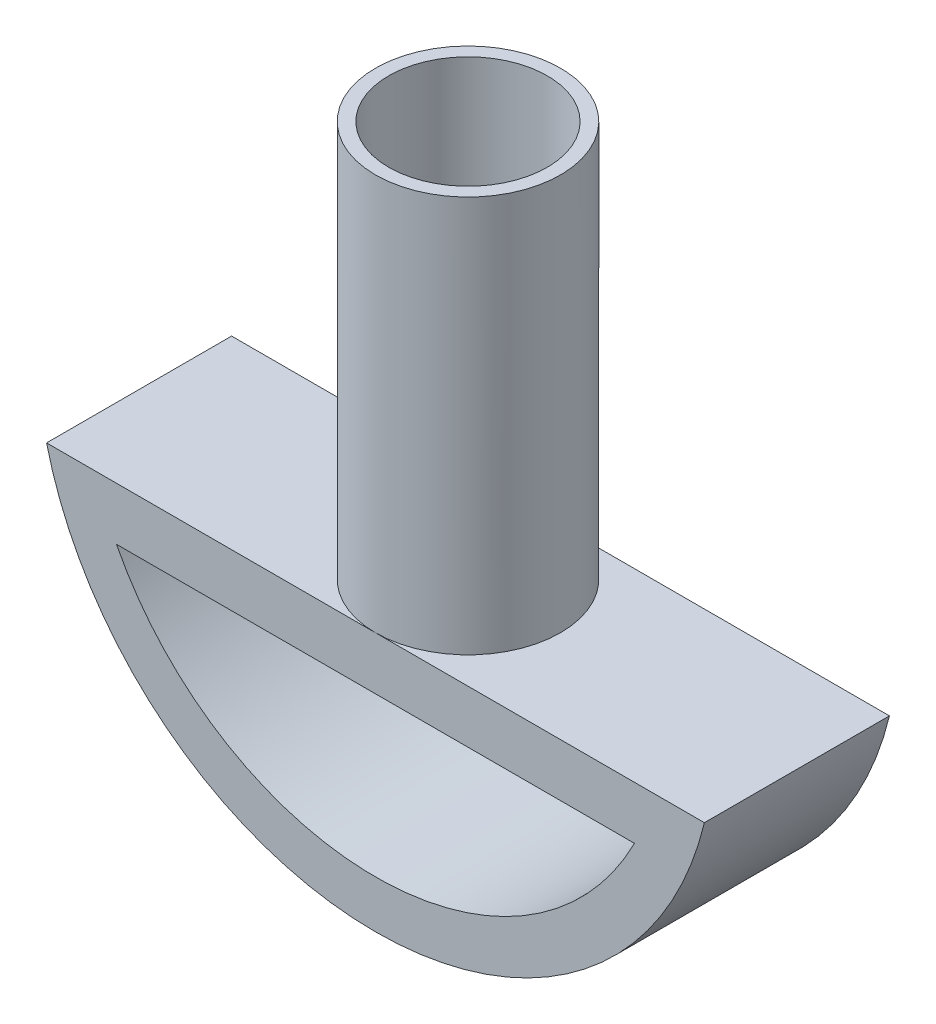
ISO-10303-21;
HEADER;
FILE_DESCRIPTION(('STEP AP214'),'2;1');
FILE_NAME('part.step','',(''),(''),'','','');
FILE_SCHEMA(('AUTOMOTIVE_DESIGN { 1 0 10303 214 1 1 1 1 }'));
ENDSEC;
DATA;
#1=APPLICATION_CONTEXT('core data for automotive mechanical design processes');
#2=APPLICATION_PROTOCOL_DEFINITION('international standard','automotive_design',2000,#1);
#3=PRODUCT_CONTEXT('',#1,'mechanical');
#4=PRODUCT('Part','Part','',(#3));
#5=PRODUCT_RELATED_PRODUCT_CATEGORY('part','',(#4));
#6=PRODUCT_DEFINITION_FORMATION('','',#4);
#7=PRODUCT_DEFINITION_CONTEXT('part definition',#1,'design');
#8=PRODUCT_DEFINITION('design','',#6,#7);
#9=PRODUCT_DEFINITION_SHAPE('','',#8);
#10=(LENGTH_UNIT() NAMED_UNIT(*) SI_UNIT(.MILLI.,.METRE.));
#11=(NAMED_UNIT(*) PLANE_ANGLE_UNIT() SI_UNIT($,.RADIAN.));
#12=(NAMED_UNIT(*) SI_UNIT($,.STERADIAN.) SOLID_ANGLE_UNIT());
#13=UNCERTAINTY_MEASURE_WITH_UNIT(LENGTH_MEASURE(1.E-05),#10,'distance_accuracy_value','');
#14=(GEOMETRIC_REPRESENTATION_CONTEXT(3) GLOBAL_UNCERTAINTY_ASSIGNED_CONTEXT((#13)) GLOBAL_UNIT_ASSIGNED_CONTEXT((#10,
#11,#12)) REPRESENTATION_CONTEXT('',''));
#15=CARTESIAN_POINT('',(0.,0.,0.));
#16=DIRECTION('',(0.,0.,1.));
#17=DIRECTION('',(1.,0.,0.));
#18=AXIS2_PLACEMENT_3D('',#15,#16,#17);
#19=CARTESIAN_POINT('',(-62.2173609212091,-15.,35.));
#20=DIRECTION('',(0.,-1.,0.));
#21=DIRECTION('',(0.,0.,-1.));
#22=AXIS2_PLACEMENT_3D('',#19,#20,#21);
#23=PLANE('',#22);
#24=CARTESIAN_POINT('',(0.,-15.,17.5));
#25=DIRECTION('',(0.,1.,0.));
#26=DIRECTION('',(0.,0.,1.));
#27=AXIS2_PLACEMENT_3D('',#24,#25,#26);
#28=CIRCLE('',#27,17.5);
#29=CARTESIAN_POINT('',(0.,-15.,0.));
#30=VERTEX_POINT('',#29);
#31=CARTESIAN_POINT('',(0.,-15.,35.));
#32=VERTEX_POINT('',#31);
#33=EDGE_CURVE('E95',#30,#32,#28,.T.);
#34=ORIENTED_EDGE('',*,*,#33,.F.);
#35=DIRECTION('',(-1.,0.,0.));
#36=VECTOR('',#35,1.);
#37=CARTESIAN_POINT('',(-62.2173609212091,-15.,0.));
#38=LINE('',#37,#36);
#39=CARTESIAN_POINT('',(-62.2173609212091,-15.,0.));
#40=VERTEX_POINT('',#39);
#41=EDGE_CURVE('E86',#30,#40,#38,.T.);
#42=ORIENTED_EDGE('',*,*,#41,.T.);
#43=DIRECTION('',(0.,0.,-1.));
#44=VECTOR('',#43,1.);
#45=CARTESIAN_POINT('',(-62.2173609212091,-15.,35.));
#46=LINE('',#45,#44);
#47=CARTESIAN_POINT('',(-62.2173609212091,-15.,35.));
#48=VERTEX_POINT('',#47);
#49=EDGE_CURVE('E42',#48,#40,#46,.T.);
#50=ORIENTED_EDGE('',*,*,#49,.F.);
#51=DIRECTION('',(-1.,0.,0.));
#52=VECTOR('',#51,1.);
#53=CARTESIAN_POINT('',(-62.2173609212091,-15.,35.));
#54=LINE('',#53,#52);
#55=EDGE_CURVE('E96',#32,#48,#54,.T.);
#56=ORIENTED_EDGE('',*,*,#55,.F.);
#57=EDGE_LOOP('',(#34,#42,#50,#56));
#58=FACE_BOUND('',#57,.T.);
#59=ADVANCED_FACE('F33',(#58),#23,.F.);
#60=CARTESIAN_POINT('',(0.,0.,35.));
#61=DIRECTION('',(0.,0.,-1.));
#62=DIRECTION('',(-1.,0.,0.));
#63=AXIS2_PLACEMENT_3D('',#60,#61,#62);
#64=CYLINDRICAL_SURFACE('',#63,64.);
#65=CARTESIAN_POINT('',(0.,0.,0.));
#66=DIRECTION('',(0.,0.,1.));
#67=DIRECTION('',(1.,0.,0.));
#68=AXIS2_PLACEMENT_3D('',#65,#66,#67);
#69=CIRCLE('',#68,64.);
#70=CARTESIAN_POINT('',(62.2173609212091,-15.,0.));
#71=VERTEX_POINT('',#70);
#72=EDGE_CURVE('E90',#40,#71,#69,.T.);
#73=ORIENTED_EDGE('',*,*,#72,.T.);
#74=DIRECTION('',(0.,0.,-1.));
#75=VECTOR('',#74,1.);
#76=CARTESIAN_POINT('',(62.2173609212091,-15.,35.));
#77=LINE('',#76,#75);
#78=CARTESIAN_POINT('',(62.2173609212091,-15.,35.));
#79=VERTEX_POINT('',#78);
#80=EDGE_CURVE('E11',#79,#71,#77,.T.);
#81=ORIENTED_EDGE('',*,*,#80,.F.);
#82=CARTESIAN_POINT('',(0.,0.,35.));
#83=DIRECTION('',(0.,0.,1.));
#84=DIRECTION('',(1.,0.,0.));
#85=AXIS2_PLACEMENT_3D('',#82,#83,#84);
#86=CIRCLE('',#85,64.);
#87=EDGE_CURVE('E85',#48,#79,#86,.T.);
#88=ORIENTED_EDGE('',*,*,#87,.F.);
#89=ORIENTED_EDGE('',*,*,#49,.T.);
#90=EDGE_LOOP('',(#73,#81,#88,#89));
#91=FACE_BOUND('',#90,.T.);
#92=ADVANCED_FACE('F35',(#91),#64,.T.);
#93=EDGE_CURVE('E49',#32,#30,#28,.T.);
#94=ORIENTED_EDGE('',*,*,#93,.F.);
#95=EDGE_CURVE('E123',#79,#32,#54,.T.);
#96=ORIENTED_EDGE('',*,*,#95,.F.);
#97=ORIENTED_EDGE('',*,*,#80,.T.);
#98=EDGE_CURVE('E78',#71,#30,#38,.T.);
#99=ORIENTED_EDGE('',*,*,#98,.T.);
#100=EDGE_LOOP('',(#94,#96,#97,#99));
#101=FACE_BOUND('',#100,.T.);
#102=ADVANCED_FACE('F80',(#101),#23,.F.);
#103=CARTESIAN_POINT('',(0.,0.,35.));
#104=DIRECTION('',(0.,0.,1.));
#105=DIRECTION('',(1.,0.,0.));
#106=AXIS2_PLACEMENT_3D('',#103,#104,#105);
#107=PLANE('',#106);
#108=CARTESIAN_POINT('',(0.,0.,35.));
#109=DIRECTION('',(0.,0.,1.));
#110=DIRECTION('',(1.,0.,0.));
#111=AXIS2_PLACEMENT_3D('',#108,#109,#110);
#112=CIRCLE('',#111,55.);
#113=CARTESIAN_POINT('',(-48.9897948556636,-25.,35.));
#114=VERTEX_POINT('',#113);
#115=CARTESIAN_POINT('',(48.9897948556636,-25.,35.));
#116=VERTEX_POINT('',#115);
#117=EDGE_CURVE('E57',#114,#116,#112,.T.);
#118=ORIENTED_EDGE('',*,*,#117,.F.);
#119=DIRECTION('',(-1.,0.,0.));
#120=VECTOR('',#119,1.);
#121=CARTESIAN_POINT('',(-48.9897948556636,-25.,35.));
#122=LINE('',#121,#120);
#123=EDGE_CURVE('E111',#116,#114,#122,.T.);
#124=ORIENTED_EDGE('',*,*,#123,.F.);
#125=EDGE_LOOP('',(#118,#124));
#126=FACE_BOUND('',#125,.T.);
#127=ORIENTED_EDGE('',*,*,#87,.T.);
#128=ORIENTED_EDGE('',*,*,#95,.T.);
#129=ORIENTED_EDGE('',*,*,#55,.T.);
#130=EDGE_LOOP('',(#127,#128,#129));
#131=FACE_BOUND('',#130,.T.);
#132=ADVANCED_FACE('F129',(#126,#131),#107,.T.);
#133=CARTESIAN_POINT('',(0.,0.,0.));
#134=DIRECTION('',(0.,0.,1.));
#135=DIRECTION('',(1.,0.,0.));
#136=AXIS2_PLACEMENT_3D('',#133,#134,#135);
#137=PLANE('',#136);
#138=DIRECTION('',(-1.,0.,0.));
#139=VECTOR('',#138,1.);
#140=CARTESIAN_POINT('',(-48.9897948556636,-25.,0.));
#141=LINE('',#140,#139);
#142=CARTESIAN_POINT('',(48.9897948556636,-25.,0.));
#143=VERTEX_POINT('',#142);
#144=CARTESIAN_POINT('',(-48.9897948556636,-25.,0.));
#145=VERTEX_POINT('',#144);
#146=EDGE_CURVE('E110',#143,#145,#141,.T.);
#147=ORIENTED_EDGE('',*,*,#146,.T.);
#148=CARTESIAN_POINT('',(0.,0.,0.));
#149=DIRECTION('',(0.,0.,1.));
#150=DIRECTION('',(1.,0.,0.));
#151=AXIS2_PLACEMENT_3D('',#148,#149,#150);
#152=CIRCLE('',#151,55.);
#153=EDGE_CURVE('E107',#145,#143,#152,.T.);
#154=ORIENTED_EDGE('',*,*,#153,.T.);
#155=EDGE_LOOP('',(#147,#154));
#156=FACE_BOUND('',#155,.T.);
#157=ORIENTED_EDGE('',*,*,#72,.F.);
#158=ORIENTED_EDGE('',*,*,#41,.F.);
#159=ORIENTED_EDGE('',*,*,#98,.F.);
#160=EDGE_LOOP('',(#157,#158,#159));
#161=FACE_BOUND('',#160,.T.);
#162=ADVANCED_FACE('F89',(#156,#161),#137,.F.);
#163=CARTESIAN_POINT('',(0.,0.,0.));
#164=DIRECTION('',(0.,0.,1.));
#165=DIRECTION('',(1.,0.,0.));
#166=AXIS2_PLACEMENT_3D('',#163,#164,#165);
#167=CYLINDRICAL_SURFACE('',#166,55.);
#168=ORIENTED_EDGE('',*,*,#117,.T.);
#169=DIRECTION('',(0.,0.,1.));
#170=VECTOR('',#169,1.);
#171=CARTESIAN_POINT('',(48.9897948556636,-25.,0.));
#172=LINE('',#171,#170);
#173=EDGE_CURVE('E114',#143,#116,#172,.T.);
#174=ORIENTED_EDGE('',*,*,#173,.F.);
#175=ORIENTED_EDGE('',*,*,#153,.F.);
#176=DIRECTION('',(0.,0.,1.));
#177=VECTOR('',#176,1.);
#178=CARTESIAN_POINT('',(-48.9897948556636,-25.,0.));
#179=LINE('',#178,#177);
#180=EDGE_CURVE('E118',#145,#114,#179,.T.);
#181=ORIENTED_EDGE('',*,*,#180,.T.);
#182=EDGE_LOOP('',(#168,#174,#175,#181));
#183=FACE_BOUND('',#182,.T.);
#184=ADVANCED_FACE('F137',(#183),#167,.F.);
#185=CARTESIAN_POINT('',(-48.9897948556636,-25.,0.));
#186=DIRECTION('',(0.,1.,0.));
#187=DIRECTION('',(0.,0.,1.));
#188=AXIS2_PLACEMENT_3D('',#185,#186,#187);
#189=PLANE('',#188);
#190=CARTESIAN_POINT('',(0.,-25.,17.5));
#191=DIRECTION('',(0.,1.,0.));
#192=DIRECTION('',(0.,0.,1.));
#193=AXIS2_PLACEMENT_3D('',#190,#191,#192);
#194=CIRCLE('',#193,7.5);
#195=CARTESIAN_POINT('',(0.,-25.,25.));
#196=VERTEX_POINT('',#195);
#197=EDGE_CURVE('E37',#196,#196,#194,.T.);
#198=ORIENTED_EDGE('',*,*,#197,.T.);
#199=EDGE_LOOP('',(#198));
#200=FACE_BOUND('',#199,.T.);
#201=ORIENTED_EDGE('',*,*,#123,.T.);
#202=ORIENTED_EDGE('',*,*,#180,.F.);
#203=ORIENTED_EDGE('',*,*,#146,.F.);
#204=ORIENTED_EDGE('',*,*,#173,.T.);
#205=EDGE_LOOP('',(#201,#202,#203,#204));
#206=FACE_BOUND('',#205,.T.);
#207=ADVANCED_FACE('F173',(#200,#206),#189,.F.);
#208=CARTESIAN_POINT('',(0.,60.,17.5));
#209=DIRECTION('',(0.,1.,0.));
#210=DIRECTION('',(0.,0.,1.));
#211=AXIS2_PLACEMENT_3D('',#208,#209,#210);
#212=PLANE('',#211);
#213=CARTESIAN_POINT('',(0.,60.,17.5));
#214=DIRECTION('',(0.,1.,0.));
#215=DIRECTION('',(0.,0.,1.));
#216=AXIS2_PLACEMENT_3D('',#213,#214,#215);
#217=CIRCLE('',#216,17.5);
#218=CARTESIAN_POINT('',(0.,60.,35.));
#219=VERTEX_POINT('',#218);
#220=EDGE_CURVE('E102',#219,#219,#217,.T.);
#221=ORIENTED_EDGE('',*,*,#220,.T.);
#222=EDGE_LOOP('',(#221));
#223=FACE_BOUND('',#222,.T.);
#224=CARTESIAN_POINT('',(0.,60.,17.5));
#225=DIRECTION('',(0.,1.,0.));
#226=DIRECTION('',(0.,0.,1.));
#227=AXIS2_PLACEMENT_3D('',#224,#225,#226);
#228=CIRCLE('',#227,15.);
#229=CARTESIAN_POINT('',(0.,60.,32.5));
#230=VERTEX_POINT('',#229);
#231=EDGE_CURVE('E99',#230,#230,#228,.T.);
#232=ORIENTED_EDGE('',*,*,#231,.F.);
#233=EDGE_LOOP('',(#232));
#234=FACE_BOUND('',#233,.T.);
#235=ADVANCED_FACE('F176',(#223,#234),#212,.T.);
#236=CARTESIAN_POINT('',(0.,60.,17.5));
#237=DIRECTION('',(0.,-1.,0.));
#238=DIRECTION('',(0.,0.,-1.));
#239=AXIS2_PLACEMENT_3D('',#236,#237,#238);
#240=CYLINDRICAL_SURFACE('',#239,17.5);
#241=ORIENTED_EDGE('',*,*,#220,.F.);
#242=EDGE_LOOP('',(#241));
#243=FACE_BOUND('',#242,.T.);
#244=ORIENTED_EDGE('',*,*,#93,.T.);
#245=ORIENTED_EDGE('',*,*,#33,.T.);
#246=EDGE_LOOP('',(#244,#245));
#247=FACE_BOUND('',#246,.T.);
#248=ADVANCED_FACE('F101',(#243,#247),#240,.T.);
#249=CARTESIAN_POINT('',(0.,60.,17.5));
#250=DIRECTION('',(0.,-1.,0.));
#251=DIRECTION('',(0.,0.,-1.));
#252=AXIS2_PLACEMENT_3D('',#249,#250,#251);
#253=CYLINDRICAL_SURFACE('',#252,15.);
#254=ORIENTED_EDGE('',*,*,#231,.T.);
#255=EDGE_LOOP('',(#254));
#256=FACE_BOUND('',#255,.T.);
#257=CARTESIAN_POINT('',(0.,-15.,17.5));
#258=DIRECTION('',(0.,1.,0.));
#259=DIRECTION('',(0.,0.,1.));
#260=AXIS2_PLACEMENT_3D('',#257,#258,#259);
#261=CIRCLE('',#260,15.);
#262=CARTESIAN_POINT('',(0.,-15.,32.5));
#263=VERTEX_POINT('',#262);
#264=EDGE_CURVE('E164',#263,#263,#261,.T.);
#265=ORIENTED_EDGE('',*,*,#264,.F.);
#266=EDGE_LOOP('',(#265));
#267=FACE_BOUND('',#266,.T.);
#268=ADVANCED_FACE('F148',(#256,#267),#253,.F.);
#269=CARTESIAN_POINT('',(0.,-15.,17.5));
#270=DIRECTION('',(0.,1.,0.));
#271=DIRECTION('',(0.,0.,1.));
#272=AXIS2_PLACEMENT_3D('',#269,#270,#271);
#273=CIRCLE('',#272,7.5);
#274=CARTESIAN_POINT('',(0.,-15.,25.));
#275=VERTEX_POINT('',#274);
#276=EDGE_CURVE('E161',#275,#275,#273,.T.);
#277=ORIENTED_EDGE('',*,*,#276,.F.);
#278=EDGE_LOOP('',(#277));
#279=FACE_BOUND('',#278,.T.);
#280=ORIENTED_EDGE('',*,*,#264,.T.);
#281=EDGE_LOOP('',(#280));
#282=FACE_BOUND('',#281,.T.);
#283=ADVANCED_FACE('F140',(#279,#282),#23,.F.);
#284=CARTESIAN_POINT('',(0.,-43.,17.5));
#285=DIRECTION('',(0.,1.,0.));
#286=DIRECTION('',(0.,0.,1.));
#287=AXIS2_PLACEMENT_3D('',#284,#285,#286);
#288=CYLINDRICAL_SURFACE('',#287,7.5);
#289=ORIENTED_EDGE('',*,*,#276,.T.);
#290=EDGE_LOOP('',(#289));
#291=FACE_BOUND('',#290,.T.);
#292=ORIENTED_EDGE('',*,*,#197,.F.);
#293=EDGE_LOOP('',(#292));
#294=FACE_BOUND('',#293,.T.);
#295=ADVANCED_FACE('F147',(#291,#294),#288,.F.);
#296=CLOSED_SHELL('',(#59,#92,#102,#132,#162,#184,#207,#235,#248,#268,#283,#295));
#297=MANIFOLD_SOLID_BREP('B2',#296);
#298=ADVANCED_BREP_SHAPE_REPRESENTATION('',(#18,#297),#14);
#299=SHAPE_DEFINITION_REPRESENTATION(#9,#298);
ENDSEC;
END-ISO-10303-21;
